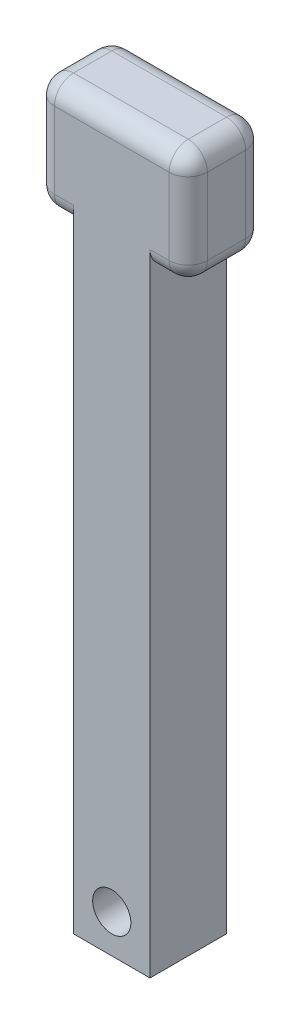
ISO-10303-21;
HEADER;
FILE_DESCRIPTION(('STEP AP214'),'2;1');
FILE_NAME('part.step','',(''),(''),'','','');
FILE_SCHEMA(('AUTOMOTIVE_DESIGN { 1 0 10303 214 1 1 1 1 }'));
ENDSEC;
DATA;
#1=APPLICATION_CONTEXT('core data for automotive mechanical design processes');
#2=APPLICATION_PROTOCOL_DEFINITION('international standard','automotive_design',2000,#1);
#3=PRODUCT_CONTEXT('',#1,'mechanical');
#4=PRODUCT('Part','Part','',(#3));
#5=PRODUCT_RELATED_PRODUCT_CATEGORY('part','',(#4));
#6=PRODUCT_DEFINITION_FORMATION('','',#4);
#7=PRODUCT_DEFINITION_CONTEXT('part definition',#1,'design');
#8=PRODUCT_DEFINITION('design','',#6,#7);
#9=PRODUCT_DEFINITION_SHAPE('','',#8);
#10=(LENGTH_UNIT() NAMED_UNIT(*) SI_UNIT(.MILLI.,.METRE.));
#11=(NAMED_UNIT(*) PLANE_ANGLE_UNIT() SI_UNIT($,.RADIAN.));
#12=(NAMED_UNIT(*) SI_UNIT($,.STERADIAN.) SOLID_ANGLE_UNIT());
#13=UNCERTAINTY_MEASURE_WITH_UNIT(LENGTH_MEASURE(1.E-05),#10,'distance_accuracy_value','');
#14=(GEOMETRIC_REPRESENTATION_CONTEXT(3) GLOBAL_UNCERTAINTY_ASSIGNED_CONTEXT((#13)) GLOBAL_UNIT_ASSIGNED_CONTEXT((#10,
#11,#12)) REPRESENTATION_CONTEXT('',''));
#15=CARTESIAN_POINT('',(0.,0.,0.));
#16=DIRECTION('',(0.,0.,1.));
#17=DIRECTION('',(1.,0.,0.));
#18=AXIS2_PLACEMENT_3D('',#15,#16,#17);
#19=CARTESIAN_POINT('',(0.5,9.5,0.5));
#20=DIRECTION('',(-1.,0.,0.));
#21=DIRECTION('',(0.,0.,1.));
#22=AXIS2_PLACEMENT_3D('',#19,#20,#21);
#23=PLANE('',#22);
#24=DIRECTION('',(0.,0.,-1.));
#25=VECTOR('',#24,1.);
#26=CARTESIAN_POINT('',(0.5,8.,0.5));
#27=LINE('',#26,#25);
#28=CARTESIAN_POINT('',(0.5,8.,0.25));
#29=VERTEX_POINT('',#28);
#30=CARTESIAN_POINT('',(0.5,8.,-0.25));
#31=VERTEX_POINT('',#30);
#32=EDGE_CURVE('E348',#29,#31,#27,.T.);
#33=ORIENTED_EDGE('',*,*,#32,.F.);
#34=CARTESIAN_POINT('',(0.5,8.25,0.25));
#35=DIRECTION('',(-1.,0.,0.));
#36=DIRECTION('',(0.,0.,1.));
#37=AXIS2_PLACEMENT_3D('',#34,#35,#36);
#38=CIRCLE('',#37,0.25);
#39=CARTESIAN_POINT('',(0.5,8.25,0.5));
#40=VERTEX_POINT('',#39);
#41=EDGE_CURVE('E169',#29,#40,#38,.T.);
#42=ORIENTED_EDGE('',*,*,#41,.T.);
#43=DIRECTION('',(0.,-1.,0.));
#44=VECTOR('',#43,1.);
#45=CARTESIAN_POINT('',(0.5,9.5,0.5));
#46=LINE('',#45,#44);
#47=CARTESIAN_POINT('',(0.5,0.,0.5));
#48=VERTEX_POINT('',#47);
#49=EDGE_CURVE('E163',#40,#48,#46,.T.);
#50=ORIENTED_EDGE('',*,*,#49,.T.);
#51=DIRECTION('',(0.,0.,-1.));
#52=VECTOR('',#51,1.);
#53=CARTESIAN_POINT('',(0.5,0.,0.5));
#54=LINE('',#53,#52);
#55=CARTESIAN_POINT('',(0.5,0.,-0.5));
#56=VERTEX_POINT('',#55);
#57=EDGE_CURVE('E166',#48,#56,#54,.T.);
#58=ORIENTED_EDGE('',*,*,#57,.T.);
#59=DIRECTION('',(0.,-1.,0.));
#60=VECTOR('',#59,1.);
#61=CARTESIAN_POINT('',(0.5,9.5,-0.5));
#62=LINE('',#61,#60);
#63=CARTESIAN_POINT('',(0.5,8.25,-0.5));
#64=VERTEX_POINT('',#63);
#65=EDGE_CURVE('E175',#64,#56,#62,.T.);
#66=ORIENTED_EDGE('',*,*,#65,.F.);
#67=CARTESIAN_POINT('',(0.5,8.25,-0.25));
#68=DIRECTION('',(-1.,0.,0.));
#69=DIRECTION('',(0.,0.,1.));
#70=AXIS2_PLACEMENT_3D('',#67,#68,#69);
#71=CIRCLE('',#70,0.25);
#72=EDGE_CURVE('E256',#64,#31,#71,.T.);
#73=ORIENTED_EDGE('',*,*,#72,.T.);
#74=EDGE_LOOP('',(#33,#42,#50,#58,#66,#73));
#75=FACE_BOUND('',#74,.T.);
#76=ADVANCED_FACE('F34',(#75),#23,.F.);
#77=CARTESIAN_POINT('',(-0.5,9.5,0.5));
#78=DIRECTION('',(0.,0.,-1.));
#79=DIRECTION('',(-1.,0.,0.));
#80=AXIS2_PLACEMENT_3D('',#77,#78,#79);
#81=PLANE('',#80);
#82=CARTESIAN_POINT('',(0.,0.5,0.5));
#83=DIRECTION('',(0.,0.,-1.));
#84=DIRECTION('',(-1.,0.,0.));
#85=AXIS2_PLACEMENT_3D('',#82,#83,#84);
#86=CIRCLE('',#85,0.250044667592874);
#87=CARTESIAN_POINT('',(-0.250044667592874,0.5,0.5));
#88=VERTEX_POINT('',#87);
#89=EDGE_CURVE('E190',#88,#88,#86,.T.);
#90=ORIENTED_EDGE('',*,*,#89,.T.);
#91=EDGE_LOOP('',(#90));
#92=FACE_BOUND('',#91,.T.);
#93=DIRECTION('',(0.,1.,0.));
#94=VECTOR('',#93,1.);
#95=CARTESIAN_POINT('',(-0.75,8.00164557196581,0.5));
#96=LINE('',#95,#94);
#97=CARTESIAN_POINT('',(-0.75,9.25,0.5));
#98=VERTEX_POINT('',#97);
#99=CARTESIAN_POINT('',(-0.75,8.25164557196581,0.5));
#100=VERTEX_POINT('',#99);
#101=EDGE_CURVE('E216',#98,#100,#96,.F.);
#102=ORIENTED_EDGE('',*,*,#101,.T.);
#103=DIRECTION('',(1.,0.,0.));
#104=VECTOR('',#103,1.);
#105=CARTESIAN_POINT('',(-0.5,8.25164557196581,0.5));
#106=LINE('',#105,#104);
#107=CARTESIAN_POINT('',(-0.5,8.25164557196581,0.5));
#108=VERTEX_POINT('',#107);
#109=EDGE_CURVE('E300',#100,#108,#106,.T.);
#110=ORIENTED_EDGE('',*,*,#109,.T.);
#111=DIRECTION('',(0.,-1.,0.));
#112=VECTOR('',#111,1.);
#113=CARTESIAN_POINT('',(-0.5,9.5,0.5));
#114=LINE('',#113,#112);
#115=CARTESIAN_POINT('',(-0.5,0.,0.5));
#116=VERTEX_POINT('',#115);
#117=EDGE_CURVE('E189',#108,#116,#114,.T.);
#118=ORIENTED_EDGE('',*,*,#117,.T.);
#119=DIRECTION('',(1.,0.,0.));
#120=VECTOR('',#119,1.);
#121=CARTESIAN_POINT('',(-0.5,0.,0.5));
#122=LINE('',#121,#120);
#123=EDGE_CURVE('E181',#116,#48,#122,.T.);
#124=ORIENTED_EDGE('',*,*,#123,.T.);
#125=ORIENTED_EDGE('',*,*,#49,.F.);
#126=DIRECTION('',(-1.,0.,0.));
#127=VECTOR('',#126,1.);
#128=CARTESIAN_POINT('',(-0.5,8.25,0.5));
#129=LINE('',#128,#127);
#130=CARTESIAN_POINT('',(0.75,8.25,0.5));
#131=VERTEX_POINT('',#130);
#132=EDGE_CURVE('E210',#40,#131,#129,.F.);
#133=ORIENTED_EDGE('',*,*,#132,.T.);
#134=DIRECTION('',(0.,-1.,0.));
#135=VECTOR('',#134,1.);
#136=CARTESIAN_POINT('',(0.75,9.5,0.5));
#137=LINE('',#136,#135);
#138=CARTESIAN_POINT('',(0.75,9.25,0.5));
#139=VERTEX_POINT('',#138);
#140=EDGE_CURVE('E212',#131,#139,#137,.F.);
#141=ORIENTED_EDGE('',*,*,#140,.T.);
#142=DIRECTION('',(1.,0.,0.));
#143=VECTOR('',#142,1.);
#144=CARTESIAN_POINT('',(-1.,9.25,0.5));
#145=LINE('',#144,#143);
#146=EDGE_CURVE('E214',#139,#98,#145,.F.);
#147=ORIENTED_EDGE('',*,*,#146,.T.);
#148=EDGE_LOOP('',(#102,#110,#118,#124,#125,#133,#141,#147));
#149=FACE_BOUND('',#148,.T.);
#150=ADVANCED_FACE('F187',(#92,#149),#81,.F.);
#151=CARTESIAN_POINT('',(-0.5,9.5,-0.5));
#152=DIRECTION('',(0.,0.,-1.));
#153=DIRECTION('',(-1.,0.,0.));
#154=AXIS2_PLACEMENT_3D('',#151,#152,#153);
#155=PLANE('',#154);
#156=CARTESIAN_POINT('',(0.,0.5,-0.5));
#157=DIRECTION('',(0.,0.,-1.));
#158=DIRECTION('',(-1.,0.,0.));
#159=AXIS2_PLACEMENT_3D('',#156,#157,#158);
#160=CIRCLE('',#159,0.250044667592874);
#161=CARTESIAN_POINT('',(-0.250044667592874,0.5,-0.5));
#162=VERTEX_POINT('',#161);
#163=EDGE_CURVE('E193',#162,#162,#160,.T.);
#164=ORIENTED_EDGE('',*,*,#163,.F.);
#165=EDGE_LOOP('',(#164));
#166=FACE_BOUND('',#165,.T.);
#167=DIRECTION('',(0.,-1.,0.));
#168=VECTOR('',#167,1.);
#169=CARTESIAN_POINT('',(-0.5,9.5,-0.5));
#170=LINE('',#169,#168);
#171=CARTESIAN_POINT('',(-0.5,8.25164557196581,-0.5));
#172=VERTEX_POINT('',#171);
#173=CARTESIAN_POINT('',(-0.5,0.,-0.5));
#174=VERTEX_POINT('',#173);
#175=EDGE_CURVE('E201',#172,#174,#170,.T.);
#176=ORIENTED_EDGE('',*,*,#175,.F.);
#177=DIRECTION('',(1.,0.,0.));
#178=VECTOR('',#177,1.);
#179=CARTESIAN_POINT('',(-1.,8.25164557196581,-0.5));
#180=LINE('',#179,#178);
#181=CARTESIAN_POINT('',(-0.75,8.25164557196581,-0.5));
#182=VERTEX_POINT('',#181);
#183=EDGE_CURVE('E230',#172,#182,#180,.F.);
#184=ORIENTED_EDGE('',*,*,#183,.T.);
#185=DIRECTION('',(0.,-1.,0.));
#186=VECTOR('',#185,1.);
#187=CARTESIAN_POINT('',(-0.75,9.5,-0.5));
#188=LINE('',#187,#186);
#189=CARTESIAN_POINT('',(-0.75,9.25,-0.5));
#190=VERTEX_POINT('',#189);
#191=EDGE_CURVE('E228',#182,#190,#188,.F.);
#192=ORIENTED_EDGE('',*,*,#191,.T.);
#193=DIRECTION('',(1.,0.,0.));
#194=VECTOR('',#193,1.);
#195=CARTESIAN_POINT('',(-0.5,9.25,-0.5));
#196=LINE('',#195,#194);
#197=CARTESIAN_POINT('',(0.75,9.25,-0.5));
#198=VERTEX_POINT('',#197);
#199=EDGE_CURVE('E226',#190,#198,#196,.T.);
#200=ORIENTED_EDGE('',*,*,#199,.T.);
#201=DIRECTION('',(0.,1.,0.));
#202=VECTOR('',#201,1.);
#203=CARTESIAN_POINT('',(0.75,9.5,-0.5));
#204=LINE('',#203,#202);
#205=CARTESIAN_POINT('',(0.75,8.25,-0.5));
#206=VERTEX_POINT('',#205);
#207=EDGE_CURVE('E223',#198,#206,#204,.F.);
#208=ORIENTED_EDGE('',*,*,#207,.T.);
#209=DIRECTION('',(-1.,0.,0.));
#210=VECTOR('',#209,1.);
#211=CARTESIAN_POINT('',(0.5,8.25,-0.5));
#212=LINE('',#211,#210);
#213=EDGE_CURVE('E220',#206,#64,#212,.T.);
#214=ORIENTED_EDGE('',*,*,#213,.T.);
#215=ORIENTED_EDGE('',*,*,#65,.T.);
#216=DIRECTION('',(1.,0.,0.));
#217=VECTOR('',#216,1.);
#218=CARTESIAN_POINT('',(-0.5,0.,-0.5));
#219=LINE('',#218,#217);
#220=EDGE_CURVE('E184',#174,#56,#219,.T.);
#221=ORIENTED_EDGE('',*,*,#220,.F.);
#222=EDGE_LOOP('',(#176,#184,#192,#200,#208,#214,#215,#221));
#223=FACE_BOUND('',#222,.T.);
#224=ADVANCED_FACE('F343',(#166,#223),#155,.T.);
#225=CARTESIAN_POINT('',(-0.5,9.5,0.5));
#226=DIRECTION('',(-1.,0.,0.));
#227=DIRECTION('',(0.,0.,1.));
#228=AXIS2_PLACEMENT_3D('',#225,#226,#227);
#229=PLANE('',#228);
#230=DIRECTION('',(0.,0.,1.));
#231=VECTOR('',#230,1.);
#232=CARTESIAN_POINT('',(-0.5,8.00164557196581,-0.5));
#233=LINE('',#232,#231);
#234=CARTESIAN_POINT('',(-0.5,8.00164557196581,-0.25));
#235=VERTEX_POINT('',#234);
#236=CARTESIAN_POINT('',(-0.5,8.00164557196581,0.25));
#237=VERTEX_POINT('',#236);
#238=EDGE_CURVE('E295',#235,#237,#233,.T.);
#239=ORIENTED_EDGE('',*,*,#238,.F.);
#240=CARTESIAN_POINT('',(-0.5,8.25164557196581,-0.25));
#241=DIRECTION('',(-1.,0.,0.));
#242=DIRECTION('',(0.,0.,1.));
#243=AXIS2_PLACEMENT_3D('',#240,#241,#242);
#244=CIRCLE('',#243,0.25);
#245=EDGE_CURVE('E252',#235,#172,#244,.F.);
#246=ORIENTED_EDGE('',*,*,#245,.T.);
#247=ORIENTED_EDGE('',*,*,#175,.T.);
#248=DIRECTION('',(0.,0.,-1.));
#249=VECTOR('',#248,1.);
#250=CARTESIAN_POINT('',(-0.5,0.,0.5));
#251=LINE('',#250,#249);
#252=EDGE_CURVE('E198',#116,#174,#251,.T.);
#253=ORIENTED_EDGE('',*,*,#252,.F.);
#254=ORIENTED_EDGE('',*,*,#117,.F.);
#255=CARTESIAN_POINT('',(-0.5,8.25164557196581,0.25));
#256=DIRECTION('',(-1.,0.,0.));
#257=DIRECTION('',(0.,0.,1.));
#258=AXIS2_PLACEMENT_3D('',#255,#256,#257);
#259=CIRCLE('',#258,0.25);
#260=EDGE_CURVE('E11',#108,#237,#259,.F.);
#261=ORIENTED_EDGE('',*,*,#260,.T.);
#262=EDGE_LOOP('',(#239,#246,#247,#253,#254,#261));
#263=FACE_BOUND('',#262,.T.);
#264=ADVANCED_FACE('F452',(#263),#229,.T.);
#265=CARTESIAN_POINT('',(0.,9.5,0.));
#266=DIRECTION('',(0.,1.,0.));
#267=DIRECTION('',(0.,0.,1.));
#268=AXIS2_PLACEMENT_3D('',#265,#266,#267);
#269=PLANE('',#268);
#270=DIRECTION('',(1.,0.,0.));
#271=VECTOR('',#270,1.);
#272=CARTESIAN_POINT('',(0.,9.5,-0.25));
#273=LINE('',#272,#271);
#274=CARTESIAN_POINT('',(0.75,9.5,-0.25));
#275=VERTEX_POINT('',#274);
#276=CARTESIAN_POINT('',(-0.75,9.5,-0.25));
#277=VERTEX_POINT('',#276);
#278=EDGE_CURVE('E235',#275,#277,#273,.F.);
#279=ORIENTED_EDGE('',*,*,#278,.T.);
#280=DIRECTION('',(0.,0.,-1.));
#281=VECTOR('',#280,1.);
#282=CARTESIAN_POINT('',(-0.75,9.5,0.));
#283=LINE('',#282,#281);
#284=CARTESIAN_POINT('',(-0.75,9.5,0.25));
#285=VERTEX_POINT('',#284);
#286=EDGE_CURVE('E239',#277,#285,#283,.F.);
#287=ORIENTED_EDGE('',*,*,#286,.T.);
#288=DIRECTION('',(1.,0.,0.));
#289=VECTOR('',#288,1.);
#290=CARTESIAN_POINT('',(1.,9.5,0.25));
#291=LINE('',#290,#289);
#292=CARTESIAN_POINT('',(0.75,9.5,0.25));
#293=VERTEX_POINT('',#292);
#294=EDGE_CURVE('E237',#285,#293,#291,.T.);
#295=ORIENTED_EDGE('',*,*,#294,.T.);
#296=DIRECTION('',(0.,0.,1.));
#297=VECTOR('',#296,1.);
#298=CARTESIAN_POINT('',(0.75,9.5,0.));
#299=LINE('',#298,#297);
#300=EDGE_CURVE('E233',#293,#275,#299,.F.);
#301=ORIENTED_EDGE('',*,*,#300,.T.);
#302=EDGE_LOOP('',(#279,#287,#295,#301));
#303=FACE_BOUND('',#302,.T.);
#304=ADVANCED_FACE('F456',(#303),#269,.T.);
#305=CARTESIAN_POINT('',(0.,0.,0.));
#306=DIRECTION('',(0.,1.,0.));
#307=DIRECTION('',(0.,0.,1.));
#308=AXIS2_PLACEMENT_3D('',#305,#306,#307);
#309=PLANE('',#308);
#310=ORIENTED_EDGE('',*,*,#123,.F.);
#311=ORIENTED_EDGE('',*,*,#252,.T.);
#312=ORIENTED_EDGE('',*,*,#220,.T.);
#313=ORIENTED_EDGE('',*,*,#57,.F.);
#314=EDGE_LOOP('',(#310,#311,#312,#313));
#315=FACE_BOUND('',#314,.T.);
#316=ADVANCED_FACE('F179',(#315),#309,.F.);
#317=CARTESIAN_POINT('',(0.,0.5,9.));
#318=DIRECTION('',(0.,0.,-1.));
#319=DIRECTION('',(-1.,0.,0.));
#320=AXIS2_PLACEMENT_3D('',#317,#318,#319);
#321=CYLINDRICAL_SURFACE('',#320,0.250044667592874);
#322=ORIENTED_EDGE('',*,*,#163,.T.);
#323=EDGE_LOOP('',(#322));
#324=FACE_BOUND('',#323,.T.);
#325=ORIENTED_EDGE('',*,*,#89,.F.);
#326=EDGE_LOOP('',(#325));
#327=FACE_BOUND('',#326,.T.);
#328=ADVANCED_FACE('F459',(#324,#327),#321,.F.);
#329=CARTESIAN_POINT('',(1.,8.,0.5));
#330=DIRECTION('',(0.,1.,0.));
#331=DIRECTION('',(0.,0.,1.));
#332=AXIS2_PLACEMENT_3D('',#329,#330,#331);
#333=PLANE('',#332);
#334=DIRECTION('',(-1.,0.,0.));
#335=VECTOR('',#334,1.);
#336=CARTESIAN_POINT('',(1.,8.,-0.25));
#337=LINE('',#336,#335);
#338=CARTESIAN_POINT('',(0.75,8.,-0.25));
#339=VERTEX_POINT('',#338);
#340=EDGE_CURVE('E248',#31,#339,#337,.F.);
#341=ORIENTED_EDGE('',*,*,#340,.T.);
#342=DIRECTION('',(0.,0.,-1.));
#343=VECTOR('',#342,1.);
#344=CARTESIAN_POINT('',(0.75,8.,0.25));
#345=LINE('',#344,#343);
#346=CARTESIAN_POINT('',(0.75,8.,0.25));
#347=VERTEX_POINT('',#346);
#348=EDGE_CURVE('E43',#339,#347,#345,.F.);
#349=ORIENTED_EDGE('',*,*,#348,.T.);
#350=DIRECTION('',(-1.,0.,0.));
#351=VECTOR('',#350,1.);
#352=CARTESIAN_POINT('',(1.,8.,0.25));
#353=LINE('',#352,#351);
#354=EDGE_CURVE('E250',#347,#29,#353,.T.);
#355=ORIENTED_EDGE('',*,*,#354,.T.);
#356=ORIENTED_EDGE('',*,*,#32,.T.);
#357=EDGE_LOOP('',(#341,#349,#355,#356));
#358=FACE_BOUND('',#357,.T.);
#359=ADVANCED_FACE('F350',(#358),#333,.F.);
#360=CARTESIAN_POINT('',(1.,0.,0.));
#361=DIRECTION('',(1.,0.,0.));
#362=DIRECTION('',(0.,0.,-1.));
#363=AXIS2_PLACEMENT_3D('',#360,#361,#362);
#364=PLANE('',#363);
#365=DIRECTION('',(0.,-1.,0.));
#366=VECTOR('',#365,1.);
#367=CARTESIAN_POINT('',(1.,8.,0.25));
#368=LINE('',#367,#366);
#369=CARTESIAN_POINT('',(1.,9.25,0.25));
#370=VERTEX_POINT('',#369);
#371=CARTESIAN_POINT('',(1.,8.25,0.25));
#372=VERTEX_POINT('',#371);
#373=EDGE_CURVE('E242',#370,#372,#368,.T.);
#374=ORIENTED_EDGE('',*,*,#373,.T.);
#375=DIRECTION('',(0.,0.,-1.));
#376=VECTOR('',#375,1.);
#377=CARTESIAN_POINT('',(1.,8.25,-0.25));
#378=LINE('',#377,#376);
#379=CARTESIAN_POINT('',(1.,8.25,-0.25));
#380=VERTEX_POINT('',#379);
#381=EDGE_CURVE('E59',#372,#380,#378,.T.);
#382=ORIENTED_EDGE('',*,*,#381,.T.);
#383=DIRECTION('',(0.,1.,0.));
#384=VECTOR('',#383,1.);
#385=CARTESIAN_POINT('',(1.,0.,-0.25));
#386=LINE('',#385,#384);
#387=CARTESIAN_POINT('',(1.,9.25,-0.25));
#388=VERTEX_POINT('',#387);
#389=EDGE_CURVE('E246',#380,#388,#386,.T.);
#390=ORIENTED_EDGE('',*,*,#389,.T.);
#391=DIRECTION('',(0.,0.,1.));
#392=VECTOR('',#391,1.);
#393=CARTESIAN_POINT('',(1.,9.25,0.));
#394=LINE('',#393,#392);
#395=EDGE_CURVE('E244',#388,#370,#394,.T.);
#396=ORIENTED_EDGE('',*,*,#395,.T.);
#397=EDGE_LOOP('',(#374,#382,#390,#396));
#398=FACE_BOUND('',#397,.T.);
#399=ADVANCED_FACE('F415',(#398),#364,.T.);
#400=CARTESIAN_POINT('',(-1.,8.00164557196581,-0.5));
#401=DIRECTION('',(0.,1.,0.));
#402=DIRECTION('',(0.,0.,1.));
#403=AXIS2_PLACEMENT_3D('',#400,#401,#402);
#404=PLANE('',#403);
#405=ORIENTED_EDGE('',*,*,#238,.T.);
#406=DIRECTION('',(1.,0.,0.));
#407=VECTOR('',#406,1.);
#408=CARTESIAN_POINT('',(-1.,8.00164557196581,0.25));
#409=LINE('',#408,#407);
#410=CARTESIAN_POINT('',(-0.75,8.00164557196581,0.25));
#411=VERTEX_POINT('',#410);
#412=EDGE_CURVE('E304',#237,#411,#409,.F.);
#413=ORIENTED_EDGE('',*,*,#412,.T.);
#414=DIRECTION('',(0.,0.,1.));
#415=VECTOR('',#414,1.);
#416=CARTESIAN_POINT('',(-0.75,8.00164557196581,-0.25));
#417=LINE('',#416,#415);
#418=CARTESIAN_POINT('',(-0.75,8.00164557196581,-0.25));
#419=VERTEX_POINT('',#418);
#420=EDGE_CURVE('E302',#411,#419,#417,.F.);
#421=ORIENTED_EDGE('',*,*,#420,.T.);
#422=DIRECTION('',(1.,0.,0.));
#423=VECTOR('',#422,1.);
#424=CARTESIAN_POINT('',(-0.5,8.00164557196581,-0.25));
#425=LINE('',#424,#423);
#426=EDGE_CURVE('E218',#419,#235,#425,.T.);
#427=ORIENTED_EDGE('',*,*,#426,.T.);
#428=EDGE_LOOP('',(#405,#413,#421,#427));
#429=FACE_BOUND('',#428,.T.);
#430=ADVANCED_FACE('F359',(#429),#404,.F.);
#431=CARTESIAN_POINT('',(-1.,0.,0.));
#432=DIRECTION('',(-1.,0.,0.));
#433=DIRECTION('',(0.,0.,1.));
#434=AXIS2_PLACEMENT_3D('',#431,#432,#433);
#435=PLANE('',#434);
#436=DIRECTION('',(0.,-1.,0.));
#437=VECTOR('',#436,1.);
#438=CARTESIAN_POINT('',(-1.,0.,-0.25));
#439=LINE('',#438,#437);
#440=CARTESIAN_POINT('',(-1.,9.25,-0.25));
#441=VERTEX_POINT('',#440);
#442=CARTESIAN_POINT('',(-1.,8.25164557196581,-0.25));
#443=VERTEX_POINT('',#442);
#444=EDGE_CURVE('E205',#441,#443,#439,.T.);
#445=ORIENTED_EDGE('',*,*,#444,.T.);
#446=DIRECTION('',(0.,0.,1.));
#447=VECTOR('',#446,1.);
#448=CARTESIAN_POINT('',(-1.,8.25164557196581,0.25));
#449=LINE('',#448,#447);
#450=CARTESIAN_POINT('',(-1.,8.25164557196581,0.25));
#451=VERTEX_POINT('',#450);
#452=EDGE_CURVE('E316',#443,#451,#449,.T.);
#453=ORIENTED_EDGE('',*,*,#452,.T.);
#454=DIRECTION('',(0.,1.,0.));
#455=VECTOR('',#454,1.);
#456=CARTESIAN_POINT('',(-1.,9.5,0.25));
#457=LINE('',#456,#455);
#458=CARTESIAN_POINT('',(-1.,9.25,0.25));
#459=VERTEX_POINT('',#458);
#460=EDGE_CURVE('E208',#451,#459,#457,.T.);
#461=ORIENTED_EDGE('',*,*,#460,.T.);
#462=DIRECTION('',(0.,0.,-1.));
#463=VECTOR('',#462,1.);
#464=CARTESIAN_POINT('',(-1.,9.25,0.));
#465=LINE('',#464,#463);
#466=EDGE_CURVE('E174',#459,#441,#465,.T.);
#467=ORIENTED_EDGE('',*,*,#466,.T.);
#468=EDGE_LOOP('',(#445,#453,#461,#467));
#469=FACE_BOUND('',#468,.T.);
#470=ADVANCED_FACE('F390',(#469),#435,.T.);
#471=CARTESIAN_POINT('',(-0.5,8.25,-0.25));
#472=DIRECTION('',(1.,0.,0.));
#473=DIRECTION('',(0.,0.,-1.));
#474=AXIS2_PLACEMENT_3D('',#471,#472,#473);
#475=CYLINDRICAL_SURFACE('',#474,0.25);
#476=ORIENTED_EDGE('',*,*,#213,.F.);
#477=CARTESIAN_POINT('',(0.75,8.25,-0.25));
#478=DIRECTION('',(1.,0.,0.));
#479=DIRECTION('',(0.,0.,-1.));
#480=AXIS2_PLACEMENT_3D('',#477,#478,#479);
#481=CIRCLE('',#480,0.25);
#482=EDGE_CURVE('E51',#206,#339,#481,.F.);
#483=ORIENTED_EDGE('',*,*,#482,.T.);
#484=ORIENTED_EDGE('',*,*,#340,.F.);
#485=ORIENTED_EDGE('',*,*,#72,.F.);
#486=EDGE_LOOP('',(#476,#483,#484,#485));
#487=FACE_BOUND('',#486,.T.);
#488=ADVANCED_FACE('F346',(#487),#475,.T.);
#489=CARTESIAN_POINT('',(0.75,0.,-0.25));
#490=DIRECTION('',(0.,1.,0.));
#491=DIRECTION('',(0.,0.,1.));
#492=AXIS2_PLACEMENT_3D('',#489,#490,#491);
#493=CYLINDRICAL_SURFACE('',#492,0.25);
#494=ORIENTED_EDGE('',*,*,#389,.F.);
#495=CARTESIAN_POINT('',(0.75,8.25,-0.25));
#496=DIRECTION('',(0.,1.,0.));
#497=DIRECTION('',(0.,0.,1.));
#498=AXIS2_PLACEMENT_3D('',#495,#496,#497);
#499=CIRCLE('',#498,0.25);
#500=EDGE_CURVE('E313',#380,#206,#499,.T.);
#501=ORIENTED_EDGE('',*,*,#500,.T.);
#502=ORIENTED_EDGE('',*,*,#207,.F.);
#503=CARTESIAN_POINT('',(0.75,9.25,-0.25));
#504=DIRECTION('',(0.,1.,0.));
#505=DIRECTION('',(0.,0.,1.));
#506=AXIS2_PLACEMENT_3D('',#503,#504,#505);
#507=CIRCLE('',#506,0.25);
#508=EDGE_CURVE('E292',#388,#198,#507,.T.);
#509=ORIENTED_EDGE('',*,*,#508,.F.);
#510=EDGE_LOOP('',(#494,#501,#502,#509));
#511=FACE_BOUND('',#510,.T.);
#512=ADVANCED_FACE('F340',(#511),#493,.T.);
#513=CARTESIAN_POINT('',(-1.,8.25164557196581,-0.25));
#514=DIRECTION('',(-1.,0.,0.));
#515=DIRECTION('',(0.,0.,1.));
#516=AXIS2_PLACEMENT_3D('',#513,#514,#515);
#517=CYLINDRICAL_SURFACE('',#516,0.25);
#518=ORIENTED_EDGE('',*,*,#426,.F.);
#519=CARTESIAN_POINT('',(-0.75,8.25164557196581,-0.25));
#520=DIRECTION('',(-1.,0.,0.));
#521=DIRECTION('',(0.,0.,1.));
#522=AXIS2_PLACEMENT_3D('',#519,#520,#521);
#523=CIRCLE('',#522,0.25);
#524=EDGE_CURVE('E298',#419,#182,#523,.F.);
#525=ORIENTED_EDGE('',*,*,#524,.T.);
#526=ORIENTED_EDGE('',*,*,#183,.F.);
#527=ORIENTED_EDGE('',*,*,#245,.F.);
#528=EDGE_LOOP('',(#518,#525,#526,#527));
#529=FACE_BOUND('',#528,.T.);
#530=ADVANCED_FACE('F379',(#529),#517,.T.);
#531=CARTESIAN_POINT('',(0.75,9.25,-0.25));
#532=DIRECTION('',(0.,0.,1.));
#533=DIRECTION('',(1.,0.,0.));
#534=AXIS2_PLACEMENT_3D('',#531,#532,#533);
#535=SPHERICAL_SURFACE('',#534,0.25);
#536=CARTESIAN_POINT('',(0.75,9.25,-0.25));
#537=DIRECTION('',(0.,0.,-1.));
#538=DIRECTION('',(-1.,0.,0.));
#539=AXIS2_PLACEMENT_3D('',#536,#537,#538);
#540=CIRCLE('',#539,0.25);
#541=EDGE_CURVE('E286',#388,#275,#540,.F.);
#542=ORIENTED_EDGE('',*,*,#541,.F.);
#543=ORIENTED_EDGE('',*,*,#508,.T.);
#544=CARTESIAN_POINT('',(0.75,9.25,-0.25));
#545=DIRECTION('',(1.,0.,0.));
#546=DIRECTION('',(0.,0.,-1.));
#547=AXIS2_PLACEMENT_3D('',#544,#545,#546);
#548=CIRCLE('',#547,0.25);
#549=EDGE_CURVE('E289',#275,#198,#548,.F.);
#550=ORIENTED_EDGE('',*,*,#549,.F.);
#551=EDGE_LOOP('',(#542,#543,#550));
#552=FACE_BOUND('',#551,.T.);
#553=ADVANCED_FACE('F408',(#552),#535,.T.);
#554=CARTESIAN_POINT('',(1.,8.25,0.25));
#555=DIRECTION('',(-1.,0.,0.));
#556=DIRECTION('',(0.,0.,1.));
#557=AXIS2_PLACEMENT_3D('',#554,#555,#556);
#558=CYLINDRICAL_SURFACE('',#557,0.25);
#559=ORIENTED_EDGE('',*,*,#354,.F.);
#560=CARTESIAN_POINT('',(0.75,8.25,0.25));
#561=DIRECTION('',(-1.,0.,0.));
#562=DIRECTION('',(0.,0.,1.));
#563=AXIS2_PLACEMENT_3D('',#560,#561,#562);
#564=CIRCLE('',#563,0.25);
#565=EDGE_CURVE('E311',#347,#131,#564,.T.);
#566=ORIENTED_EDGE('',*,*,#565,.T.);
#567=ORIENTED_EDGE('',*,*,#132,.F.);
#568=ORIENTED_EDGE('',*,*,#41,.F.);
#569=EDGE_LOOP('',(#559,#566,#567,#568));
#570=FACE_BOUND('',#569,.T.);
#571=ADVANCED_FACE('F423',(#570),#558,.T.);
#572=CARTESIAN_POINT('',(-0.75,0.,-0.25));
#573=DIRECTION('',(0.,-1.,0.));
#574=DIRECTION('',(0.,0.,-1.));
#575=AXIS2_PLACEMENT_3D('',#572,#573,#574);
#576=CYLINDRICAL_SURFACE('',#575,0.25);
#577=ORIENTED_EDGE('',*,*,#191,.F.);
#578=CARTESIAN_POINT('',(-0.75,8.25164557196581,-0.25));
#579=DIRECTION('',(0.,-1.,0.));
#580=DIRECTION('',(0.,0.,-1.));
#581=AXIS2_PLACEMENT_3D('',#578,#579,#580);
#582=CIRCLE('',#581,0.25);
#583=EDGE_CURVE('E258',#182,#443,#582,.F.);
#584=ORIENTED_EDGE('',*,*,#583,.T.);
#585=ORIENTED_EDGE('',*,*,#444,.F.);
#586=CARTESIAN_POINT('',(-0.75,9.25,-0.25));
#587=DIRECTION('',(0.,1.,0.));
#588=DIRECTION('',(0.,0.,1.));
#589=AXIS2_PLACEMENT_3D('',#586,#587,#588);
#590=CIRCLE('',#589,0.25);
#591=EDGE_CURVE('E283',#190,#441,#590,.T.);
#592=ORIENTED_EDGE('',*,*,#591,.F.);
#593=EDGE_LOOP('',(#577,#584,#585,#592));
#594=FACE_BOUND('',#593,.T.);
#595=ADVANCED_FACE('F387',(#594),#576,.T.);
#596=CARTESIAN_POINT('',(-0.5,9.25,-0.25));
#597=DIRECTION('',(1.,0.,0.));
#598=DIRECTION('',(0.,0.,-1.));
#599=AXIS2_PLACEMENT_3D('',#596,#597,#598);
#600=CYLINDRICAL_SURFACE('',#599,0.25);
#601=ORIENTED_EDGE('',*,*,#549,.T.);
#602=ORIENTED_EDGE('',*,*,#199,.F.);
#603=CARTESIAN_POINT('',(-0.75,9.25,-0.25));
#604=DIRECTION('',(-1.,0.,0.));
#605=DIRECTION('',(0.,0.,1.));
#606=AXIS2_PLACEMENT_3D('',#603,#604,#605);
#607=CIRCLE('',#606,0.25);
#608=EDGE_CURVE('E280',#277,#190,#607,.T.);
#609=ORIENTED_EDGE('',*,*,#608,.F.);
#610=ORIENTED_EDGE('',*,*,#278,.F.);
#611=EDGE_LOOP('',(#601,#602,#609,#610));
#612=FACE_BOUND('',#611,.T.);
#613=ADVANCED_FACE('F404',(#612),#600,.T.);
#614=CARTESIAN_POINT('',(0.75,9.25,0.));
#615=DIRECTION('',(0.,0.,1.));
#616=DIRECTION('',(1.,0.,0.));
#617=AXIS2_PLACEMENT_3D('',#614,#615,#616);
#618=CYLINDRICAL_SURFACE('',#617,0.25);
#619=ORIENTED_EDGE('',*,*,#541,.T.);
#620=ORIENTED_EDGE('',*,*,#300,.F.);
#621=CARTESIAN_POINT('',(0.75,9.25,0.25));
#622=DIRECTION('',(0.,0.,1.));
#623=DIRECTION('',(1.,0.,0.));
#624=AXIS2_PLACEMENT_3D('',#621,#622,#623);
#625=CIRCLE('',#624,0.25);
#626=EDGE_CURVE('E277',#370,#293,#625,.T.);
#627=ORIENTED_EDGE('',*,*,#626,.F.);
#628=ORIENTED_EDGE('',*,*,#395,.F.);
#629=EDGE_LOOP('',(#619,#620,#627,#628));
#630=FACE_BOUND('',#629,.T.);
#631=ADVANCED_FACE('F413',(#630),#618,.T.);
#632=CARTESIAN_POINT('',(0.75,0.,0.25));
#633=DIRECTION('',(0.,1.,0.));
#634=DIRECTION('',(0.,0.,1.));
#635=AXIS2_PLACEMENT_3D('',#632,#633,#634);
#636=CYLINDRICAL_SURFACE('',#635,0.25);
#637=ORIENTED_EDGE('',*,*,#140,.F.);
#638=CARTESIAN_POINT('',(0.75,8.25,0.25));
#639=DIRECTION('',(0.,1.,0.));
#640=DIRECTION('',(0.,0.,1.));
#641=AXIS2_PLACEMENT_3D('',#638,#639,#640);
#642=CIRCLE('',#641,0.25);
#643=EDGE_CURVE('E308',#131,#372,#642,.T.);
#644=ORIENTED_EDGE('',*,*,#643,.T.);
#645=ORIENTED_EDGE('',*,*,#373,.F.);
#646=CARTESIAN_POINT('',(0.75,9.25,0.25));
#647=DIRECTION('',(0.,1.,0.));
#648=DIRECTION('',(0.,0.,1.));
#649=AXIS2_PLACEMENT_3D('',#646,#647,#648);
#650=CIRCLE('',#649,0.25);
#651=EDGE_CURVE('E274',#139,#370,#650,.T.);
#652=ORIENTED_EDGE('',*,*,#651,.F.);
#653=EDGE_LOOP('',(#637,#644,#645,#652));
#654=FACE_BOUND('',#653,.T.);
#655=ADVANCED_FACE('F419',(#654),#636,.T.);
#656=CARTESIAN_POINT('',(-0.75,9.25,-0.25));
#657=DIRECTION('',(0.,0.,1.));
#658=DIRECTION('',(1.,0.,0.));
#659=AXIS2_PLACEMENT_3D('',#656,#657,#658);
#660=SPHERICAL_SURFACE('',#659,0.25);
#661=ORIENTED_EDGE('',*,*,#608,.T.);
#662=ORIENTED_EDGE('',*,*,#591,.T.);
#663=CARTESIAN_POINT('',(-0.75,9.25,-0.25));
#664=DIRECTION('',(0.,0.,-1.));
#665=DIRECTION('',(-1.,0.,0.));
#666=AXIS2_PLACEMENT_3D('',#663,#664,#665);
#667=CIRCLE('',#666,0.25);
#668=EDGE_CURVE('E271',#277,#441,#667,.F.);
#669=ORIENTED_EDGE('',*,*,#668,.F.);
#670=EDGE_LOOP('',(#661,#662,#669));
#671=FACE_BOUND('',#670,.T.);
#672=ADVANCED_FACE('F400',(#671),#660,.T.);
#673=CARTESIAN_POINT('',(0.75,9.25,0.25));
#674=DIRECTION('',(0.,0.,1.));
#675=DIRECTION('',(1.,0.,0.));
#676=AXIS2_PLACEMENT_3D('',#673,#674,#675);
#677=SPHERICAL_SURFACE('',#676,0.25);
#678=ORIENTED_EDGE('',*,*,#651,.T.);
#679=ORIENTED_EDGE('',*,*,#626,.T.);
#680=CARTESIAN_POINT('',(0.75,9.25,0.25));
#681=DIRECTION('',(1.,0.,0.));
#682=DIRECTION('',(0.,0.,-1.));
#683=AXIS2_PLACEMENT_3D('',#680,#681,#682);
#684=CIRCLE('',#683,0.25);
#685=EDGE_CURVE('E268',#139,#293,#684,.F.);
#686=ORIENTED_EDGE('',*,*,#685,.F.);
#687=EDGE_LOOP('',(#678,#679,#686));
#688=FACE_BOUND('',#687,.T.);
#689=ADVANCED_FACE('F632',(#688),#677,.T.);
#690=CARTESIAN_POINT('',(-0.75,9.25,0.));
#691=DIRECTION('',(0.,0.,-1.));
#692=DIRECTION('',(-1.,0.,0.));
#693=AXIS2_PLACEMENT_3D('',#690,#691,#692);
#694=CYLINDRICAL_SURFACE('',#693,0.25);
#695=ORIENTED_EDGE('',*,*,#668,.T.);
#696=ORIENTED_EDGE('',*,*,#466,.F.);
#697=CARTESIAN_POINT('',(-0.75,9.25,0.25));
#698=DIRECTION('',(0.,0.,1.));
#699=DIRECTION('',(1.,0.,0.));
#700=AXIS2_PLACEMENT_3D('',#697,#698,#699);
#701=CIRCLE('',#700,0.25);
#702=EDGE_CURVE('E265',#285,#459,#701,.T.);
#703=ORIENTED_EDGE('',*,*,#702,.F.);
#704=ORIENTED_EDGE('',*,*,#286,.F.);
#705=EDGE_LOOP('',(#695,#696,#703,#704));
#706=FACE_BOUND('',#705,.T.);
#707=ADVANCED_FACE('F395',(#706),#694,.T.);
#708=CARTESIAN_POINT('',(0.,9.25,0.25));
#709=DIRECTION('',(-1.,0.,0.));
#710=DIRECTION('',(0.,0.,1.));
#711=AXIS2_PLACEMENT_3D('',#708,#709,#710);
#712=CYLINDRICAL_SURFACE('',#711,0.25);
#713=ORIENTED_EDGE('',*,*,#685,.T.);
#714=ORIENTED_EDGE('',*,*,#294,.F.);
#715=CARTESIAN_POINT('',(-0.75,9.25,0.25));
#716=DIRECTION('',(-1.,0.,0.));
#717=DIRECTION('',(0.,0.,1.));
#718=AXIS2_PLACEMENT_3D('',#715,#716,#717);
#719=CIRCLE('',#718,0.25);
#720=EDGE_CURVE('E262',#98,#285,#719,.T.);
#721=ORIENTED_EDGE('',*,*,#720,.F.);
#722=ORIENTED_EDGE('',*,*,#146,.F.);
#723=EDGE_LOOP('',(#713,#714,#721,#722));
#724=FACE_BOUND('',#723,.T.);
#725=ADVANCED_FACE('F428',(#724),#712,.T.);
#726=CARTESIAN_POINT('',(-0.75,9.25,0.25));
#727=DIRECTION('',(0.,0.,1.));
#728=DIRECTION('',(1.,0.,0.));
#729=AXIS2_PLACEMENT_3D('',#726,#727,#728);
#730=SPHERICAL_SURFACE('',#729,0.25);
#731=ORIENTED_EDGE('',*,*,#720,.T.);
#732=ORIENTED_EDGE('',*,*,#702,.T.);
#733=CARTESIAN_POINT('',(-0.75,9.25,0.25));
#734=DIRECTION('',(0.,1.,0.));
#735=DIRECTION('',(0.,0.,1.));
#736=AXIS2_PLACEMENT_3D('',#733,#734,#735);
#737=CIRCLE('',#736,0.25);
#738=EDGE_CURVE('E259',#98,#459,#737,.F.);
#739=ORIENTED_EDGE('',*,*,#738,.F.);
#740=EDGE_LOOP('',(#731,#732,#739));
#741=FACE_BOUND('',#740,.T.);
#742=ADVANCED_FACE('F433',(#741),#730,.T.);
#743=CARTESIAN_POINT('',(-0.75,0.,0.25));
#744=DIRECTION('',(0.,-1.,0.));
#745=DIRECTION('',(0.,0.,-1.));
#746=AXIS2_PLACEMENT_3D('',#743,#744,#745);
#747=CYLINDRICAL_SURFACE('',#746,0.25);
#748=ORIENTED_EDGE('',*,*,#460,.F.);
#749=CARTESIAN_POINT('',(-0.75,8.25164557196581,0.25));
#750=DIRECTION('',(0.,-1.,0.));
#751=DIRECTION('',(0.,0.,-1.));
#752=AXIS2_PLACEMENT_3D('',#749,#750,#751);
#753=CIRCLE('',#752,0.25);
#754=EDGE_CURVE('E306',#451,#100,#753,.F.);
#755=ORIENTED_EDGE('',*,*,#754,.T.);
#756=ORIENTED_EDGE('',*,*,#101,.F.);
#757=ORIENTED_EDGE('',*,*,#738,.T.);
#758=EDGE_LOOP('',(#748,#755,#756,#757));
#759=FACE_BOUND('',#758,.T.);
#760=ADVANCED_FACE('F432',(#759),#747,.T.);
#761=CARTESIAN_POINT('',(-0.5,8.25164557196581,0.25));
#762=DIRECTION('',(1.,0.,0.));
#763=DIRECTION('',(0.,0.,-1.));
#764=AXIS2_PLACEMENT_3D('',#761,#762,#763);
#765=CYLINDRICAL_SURFACE('',#764,0.25);
#766=ORIENTED_EDGE('',*,*,#260,.F.);
#767=ORIENTED_EDGE('',*,*,#109,.F.);
#768=CARTESIAN_POINT('',(-0.75,8.25164557196581,0.25));
#769=DIRECTION('',(-1.,0.,0.));
#770=DIRECTION('',(0.,0.,1.));
#771=AXIS2_PLACEMENT_3D('',#768,#769,#770);
#772=CIRCLE('',#771,0.25);
#773=EDGE_CURVE('E263',#411,#100,#772,.T.);
#774=ORIENTED_EDGE('',*,*,#773,.F.);
#775=ORIENTED_EDGE('',*,*,#412,.F.);
#776=EDGE_LOOP('',(#766,#767,#774,#775));
#777=FACE_BOUND('',#776,.T.);
#778=ADVANCED_FACE('F366',(#777),#765,.T.);
#779=CARTESIAN_POINT('',(-0.75,8.25164557196581,0.25));
#780=DIRECTION('',(0.,1.,0.));
#781=DIRECTION('',(0.,0.,1.));
#782=AXIS2_PLACEMENT_3D('',#779,#780,#781);
#783=SPHERICAL_SURFACE('',#782,0.25);
#784=ORIENTED_EDGE('',*,*,#773,.T.);
#785=ORIENTED_EDGE('',*,*,#754,.F.);
#786=CARTESIAN_POINT('',(-0.75,8.25164557196581,0.25));
#787=DIRECTION('',(0.,0.,-1.));
#788=DIRECTION('',(-1.,0.,0.));
#789=AXIS2_PLACEMENT_3D('',#786,#787,#788);
#790=CIRCLE('',#789,0.25);
#791=EDGE_CURVE('E322',#411,#451,#790,.T.);
#792=ORIENTED_EDGE('',*,*,#791,.F.);
#793=EDGE_LOOP('',(#784,#785,#792));
#794=FACE_BOUND('',#793,.T.);
#795=ADVANCED_FACE('F372',(#794),#783,.T.);
#796=CARTESIAN_POINT('',(-0.75,8.25164557196581,0.));
#797=DIRECTION('',(0.,0.,-1.));
#798=DIRECTION('',(-1.,0.,0.));
#799=AXIS2_PLACEMENT_3D('',#796,#797,#798);
#800=CYLINDRICAL_SURFACE('',#799,0.25);
#801=ORIENTED_EDGE('',*,*,#791,.T.);
#802=ORIENTED_EDGE('',*,*,#452,.F.);
#803=CARTESIAN_POINT('',(-0.75,8.25164557196581,-0.25));
#804=DIRECTION('',(0.,0.,-1.));
#805=DIRECTION('',(-1.,0.,0.));
#806=AXIS2_PLACEMENT_3D('',#803,#804,#805);
#807=CIRCLE('',#806,0.25);
#808=EDGE_CURVE('E320',#419,#443,#807,.T.);
#809=ORIENTED_EDGE('',*,*,#808,.F.);
#810=ORIENTED_EDGE('',*,*,#420,.F.);
#811=EDGE_LOOP('',(#801,#802,#809,#810));
#812=FACE_BOUND('',#811,.T.);
#813=ADVANCED_FACE('F376',(#812),#800,.T.);
#814=CARTESIAN_POINT('',(-0.75,8.25164557196581,-0.25));
#815=DIRECTION('',(0.,0.,1.));
#816=DIRECTION('',(1.,0.,0.));
#817=AXIS2_PLACEMENT_3D('',#814,#815,#816);
#818=SPHERICAL_SURFACE('',#817,0.25);
#819=ORIENTED_EDGE('',*,*,#583,.F.);
#820=ORIENTED_EDGE('',*,*,#524,.F.);
#821=ORIENTED_EDGE('',*,*,#808,.T.);
#822=EDGE_LOOP('',(#819,#820,#821));
#823=FACE_BOUND('',#822,.T.);
#824=ADVANCED_FACE('F383',(#823),#818,.T.);
#825=CARTESIAN_POINT('',(0.75,8.25,-0.25));
#826=DIRECTION('',(0.,0.,1.));
#827=DIRECTION('',(1.,0.,0.));
#828=AXIS2_PLACEMENT_3D('',#825,#826,#827);
#829=SPHERICAL_SURFACE('',#828,0.25);
#830=ORIENTED_EDGE('',*,*,#482,.F.);
#831=ORIENTED_EDGE('',*,*,#500,.F.);
#832=CARTESIAN_POINT('',(0.75,8.25,-0.25));
#833=DIRECTION('',(0.,0.,1.));
#834=DIRECTION('',(1.,0.,0.));
#835=AXIS2_PLACEMENT_3D('',#832,#833,#834);
#836=CIRCLE('',#835,0.25);
#837=EDGE_CURVE('E38',#339,#380,#836,.T.);
#838=ORIENTED_EDGE('',*,*,#837,.F.);
#839=EDGE_LOOP('',(#830,#831,#838));
#840=FACE_BOUND('',#839,.T.);
#841=ADVANCED_FACE('F36',(#840),#829,.T.);
#842=CARTESIAN_POINT('',(0.75,8.25,0.));
#843=DIRECTION('',(0.,0.,1.));
#844=DIRECTION('',(1.,0.,0.));
#845=AXIS2_PLACEMENT_3D('',#842,#843,#844);
#846=CYLINDRICAL_SURFACE('',#845,0.25);
#847=ORIENTED_EDGE('',*,*,#837,.T.);
#848=ORIENTED_EDGE('',*,*,#381,.F.);
#849=CARTESIAN_POINT('',(0.75,8.25,0.25));
#850=DIRECTION('',(0.,0.,1.));
#851=DIRECTION('',(1.,0.,0.));
#852=AXIS2_PLACEMENT_3D('',#849,#850,#851);
#853=CIRCLE('',#852,0.25);
#854=EDGE_CURVE('E326',#347,#372,#853,.T.);
#855=ORIENTED_EDGE('',*,*,#854,.F.);
#856=ORIENTED_EDGE('',*,*,#348,.F.);
#857=EDGE_LOOP('',(#847,#848,#855,#856));
#858=FACE_BOUND('',#857,.T.);
#859=ADVANCED_FACE('F335',(#858),#846,.T.);
#860=CARTESIAN_POINT('',(0.75,8.25,0.25));
#861=DIRECTION('',(0.,0.,1.));
#862=DIRECTION('',(1.,0.,0.));
#863=AXIS2_PLACEMENT_3D('',#860,#861,#862);
#864=SPHERICAL_SURFACE('',#863,0.25);
#865=ORIENTED_EDGE('',*,*,#643,.F.);
#866=ORIENTED_EDGE('',*,*,#565,.F.);
#867=ORIENTED_EDGE('',*,*,#854,.T.);
#868=EDGE_LOOP('',(#865,#866,#867));
#869=FACE_BOUND('',#868,.T.);
#870=ADVANCED_FACE('F421',(#869),#864,.T.);
#871=CLOSED_SHELL('',(#76,#150,#224,#264,#304,#316,#328,#359,#399,#430,#470,#488,#512,#530,#553,
#571,#595,#613,#631,#655,#672,#689,#707,#725,#742,#760,#778,#795,#813,#824,#841,#859,#870));
#872=MANIFOLD_SOLID_BREP('B2',#871);
#873=ADVANCED_BREP_SHAPE_REPRESENTATION('',(#18,#872),#14);
#874=SHAPE_DEFINITION_REPRESENTATION(#9,#873);
ENDSEC;
END-ISO-10303-21;
